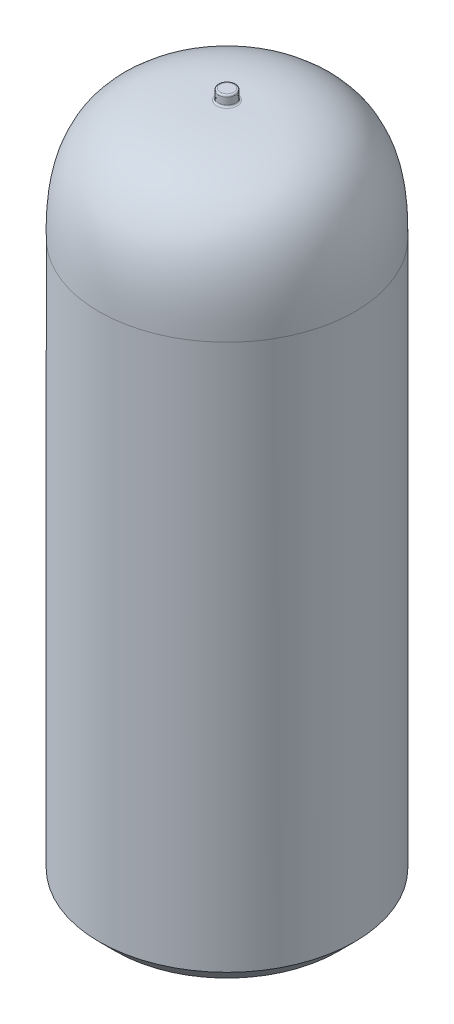
ISO-10303-21;
HEADER;
FILE_DESCRIPTION(('STEP AP214'),'2;1');
FILE_NAME('part.step','',(''),(''),'','','');
FILE_SCHEMA(('AUTOMOTIVE_DESIGN { 1 0 10303 214 1 1 1 1 }'));
ENDSEC;
DATA;
#1=APPLICATION_CONTEXT('core data for automotive mechanical design processes');
#2=APPLICATION_PROTOCOL_DEFINITION('international standard','automotive_design',2000,#1);
#3=PRODUCT_CONTEXT('',#1,'mechanical');
#4=PRODUCT('Part','Part','',(#3));
#5=PRODUCT_RELATED_PRODUCT_CATEGORY('part','',(#4));
#6=PRODUCT_DEFINITION_FORMATION('','',#4);
#7=PRODUCT_DEFINITION_CONTEXT('part definition',#1,'design');
#8=PRODUCT_DEFINITION('design','',#6,#7);
#9=PRODUCT_DEFINITION_SHAPE('','',#8);
#10=(LENGTH_UNIT() NAMED_UNIT(*) SI_UNIT(.MILLI.,.METRE.));
#11=(NAMED_UNIT(*) PLANE_ANGLE_UNIT() SI_UNIT($,.RADIAN.));
#12=(NAMED_UNIT(*) SI_UNIT($,.STERADIAN.) SOLID_ANGLE_UNIT());
#13=UNCERTAINTY_MEASURE_WITH_UNIT(LENGTH_MEASURE(1.E-05),#10,'distance_accuracy_value','');
#14=(GEOMETRIC_REPRESENTATION_CONTEXT(3) GLOBAL_UNCERTAINTY_ASSIGNED_CONTEXT((#13)) GLOBAL_UNIT_ASSIGNED_CONTEXT((#10,
#11,#12)) REPRESENTATION_CONTEXT('',''));
#15=CARTESIAN_POINT('',(0.,0.,0.));
#16=DIRECTION('',(0.,0.,1.));
#17=DIRECTION('',(1.,0.,0.));
#18=AXIS2_PLACEMENT_3D('',#15,#16,#17);
#19=CARTESIAN_POINT('',(0.,0.,0.));
#20=DIRECTION('',(0.,1.,0.));
#21=DIRECTION('',(0.,0.,1.));
#22=AXIS2_PLACEMENT_3D('',#19,#20,#21);
#23=PLANE('',#22);
#24=CARTESIAN_POINT('',(0.,0.,0.));
#25=DIRECTION('',(0.,1.,0.));
#26=DIRECTION('',(0.,0.,1.));
#27=AXIS2_PLACEMENT_3D('',#24,#25,#26);
#28=CIRCLE('',#27,6.5);
#29=CARTESIAN_POINT('',(0.,0.,6.5));
#30=VERTEX_POINT('',#29);
#31=EDGE_CURVE('E10',#30,#30,#28,.F.);
#32=ORIENTED_EDGE('',*,*,#31,.T.);
#33=EDGE_LOOP('',(#32));
#34=FACE_BOUND('',#33,.T.);
#35=ADVANCED_FACE('F33',(#34),#23,.F.);
#36=CARTESIAN_POINT('',(0.,40.,0.));
#37=DIRECTION('',(0.,1.,0.));
#38=DIRECTION('',(0.,0.,1.));
#39=AXIS2_PLACEMENT_3D('',#36,#37,#38);
#40=CYLINDRICAL_SURFACE('',#39,7.5);
#41=CARTESIAN_POINT('',(0.,1.,0.));
#42=DIRECTION('',(0.,1.,0.));
#43=DIRECTION('',(0.,0.,1.));
#44=AXIS2_PLACEMENT_3D('',#41,#42,#43);
#45=CIRCLE('',#44,7.5);
#46=CARTESIAN_POINT('',(0.,1.,7.5));
#47=VERTEX_POINT('',#46);
#48=EDGE_CURVE('E40',#47,#47,#45,.T.);
#49=ORIENTED_EDGE('',*,*,#48,.T.);
#50=EDGE_LOOP('',(#49));
#51=FACE_BOUND('',#50,.T.);
#52=CARTESIAN_POINT('',(0.,33.,7.5));
#53=CARTESIAN_POINT('',(0.981615593537487,33.,7.5));
#54=CARTESIAN_POINT('',(2.94484678061248,33.,7.10948903686533));
#55=CARTESIAN_POINT('',(5.4413673339792,33.,5.44136733397921));
#56=CARTESIAN_POINT('',(7.10948903686534,33.,2.94484678061246));
#57=CARTESIAN_POINT('',(7.69525548156733,33.,0.));
#58=CARTESIAN_POINT('',(7.10948903686534,33.,-2.94484678061245));
#59=CARTESIAN_POINT('',(5.44136733397921,33.,-5.44136733397921));
#60=CARTESIAN_POINT('',(2.94484678061246,33.,-7.10948903686534));
#61=CARTESIAN_POINT('',(0.,33.,-7.69525548156733));
#62=CARTESIAN_POINT('',(-2.94484678061246,33.,-7.10948903686534));
#63=CARTESIAN_POINT('',(-5.44136733397921,33.,-5.44136733397922));
#64=CARTESIAN_POINT('',(-7.10948903686534,33.,-2.94484678061246));
#65=CARTESIAN_POINT('',(-7.69525548156733,33.,0.));
#66=CARTESIAN_POINT('',(-7.10948903686533,33.,2.94484678061248));
#67=CARTESIAN_POINT('',(-5.44136733397922,33.,5.4413673339792));
#68=CARTESIAN_POINT('',(-2.94484678061244,33.,7.10948903686535));
#69=CARTESIAN_POINT('',(-0.981615593537485,33.,7.5));
#70=CARTESIAN_POINT('',(0.,33.,7.5));
#71=B_SPLINE_CURVE_WITH_KNOTS('',3,(#52,#53,#54,#55,#56,#57,#58,#59,#60,#61,#62,#63,#64,#65,#66,
#67,#68,#69,#70),.UNSPECIFIED.,.T.,.F.,(4,1,1,1,1,1,1,1,1,1,1,1,1,1,1,1,4),(-3.14159265358979,
-2.74889357189107,-2.35619449019234,-1.96349540849362,-1.5707963267949,-1.17809724509617,
-0.785398163397448,-0.392699081698724,0.,0.392699081698724,0.785398163397448,1.17809724509617,
1.5707963267949,1.96349540849362,2.35619449019235,2.74889357189107,3.14159265358979),.UNSPECIFIED.);
#72=CARTESIAN_POINT('',(0.,33.,7.5));
#73=VERTEX_POINT('',#72);
#74=EDGE_CURVE('E191',#73,#73,#71,.F.);
#75=ORIENTED_EDGE('',*,*,#74,.T.);
#76=EDGE_LOOP('',(#75));
#77=FACE_BOUND('',#76,.T.);
#78=ADVANCED_FACE('F139',(#51,#77),#40,.T.);
#79=CARTESIAN_POINT('',(0.,33.,7.5));
#80=CARTESIAN_POINT('',(-0.981615593537485,33.,7.5));
#81=CARTESIAN_POINT('',(-2.94484678061244,33.,7.10948903686535));
#82=CARTESIAN_POINT('',(-5.44136733397922,33.,5.4413673339792));
#83=CARTESIAN_POINT('',(-7.10948903686533,33.,2.94484678061248));
#84=CARTESIAN_POINT('',(-7.69525548156733,33.,0.));
#85=CARTESIAN_POINT('',(-7.10948903686534,33.,-2.94484678061246));
#86=CARTESIAN_POINT('',(-5.44136733397921,33.,-5.44136733397922));
#87=CARTESIAN_POINT('',(-2.94484678061246,33.,-7.10948903686534));
#88=CARTESIAN_POINT('',(0.,33.,-7.69525548156733));
#89=CARTESIAN_POINT('',(2.94484678061246,33.,-7.10948903686534));
#90=CARTESIAN_POINT('',(5.44136733397921,33.,-5.44136733397921));
#91=CARTESIAN_POINT('',(7.10948903686534,33.,-2.94484678061245));
#92=CARTESIAN_POINT('',(7.69525548156733,33.,0.));
#93=CARTESIAN_POINT('',(7.10948903686534,33.,2.94484678061246));
#94=CARTESIAN_POINT('',(5.4413673339792,33.,5.44136733397921));
#95=CARTESIAN_POINT('',(2.94484678061248,33.,7.10948903686533));
#96=CARTESIAN_POINT('',(0.981615593537487,33.,7.5));
#97=CARTESIAN_POINT('',(0.,33.,7.5));
#98=CARTESIAN_POINT('',(0.,34.1773863607376,7.5));
#99=CARTESIAN_POINT('',(-0.981615593537485,34.1773863607376,7.5));
#100=CARTESIAN_POINT('',(-2.94484678061244,34.1773863607376,7.10948903686535));
#101=CARTESIAN_POINT('',(-5.44136733397922,34.1773863607376,5.4413673339792));
#102=CARTESIAN_POINT('',(-7.10948903686533,34.1773863607376,2.94484678061248));
#103=CARTESIAN_POINT('',(-7.69525548156733,34.1773863607376,0.));
#104=CARTESIAN_POINT('',(-7.10948903686534,34.1773863607376,-2.94484678061246));
#105=CARTESIAN_POINT('',(-5.44136733397921,34.1773863607376,-5.44136733397922));
#106=CARTESIAN_POINT('',(-2.94484678061246,34.1773863607376,-7.10948903686534));
#107=CARTESIAN_POINT('',(0.,34.1773863607376,-7.69525548156733));
#108=CARTESIAN_POINT('',(2.94484678061246,34.1773863607376,-7.10948903686534));
#109=CARTESIAN_POINT('',(5.44136733397921,34.1773863607376,-5.44136733397921));
#110=CARTESIAN_POINT('',(7.10948903686534,34.1773863607376,-2.94484678061245));
#111=CARTESIAN_POINT('',(7.69525548156733,34.1773863607376,0.));
#112=CARTESIAN_POINT('',(7.10948903686534,34.1773863607376,2.94484678061246));
#113=CARTESIAN_POINT('',(5.4413673339792,34.1773863607376,5.44136733397921));
#114=CARTESIAN_POINT('',(2.94484678061248,34.1773863607376,7.10948903686533));
#115=CARTESIAN_POINT('',(0.981615593537487,34.1773863607376,7.5));
#116=CARTESIAN_POINT('',(0.,34.1773863607376,7.5));
#117=CARTESIAN_POINT('',(0.,35.3547727214752,7.5));
#118=CARTESIAN_POINT('',(-0.981615593537485,35.3547727214752,7.5));
#119=CARTESIAN_POINT('',(-2.94484678061244,35.3547727214753,7.10948903686535));
#120=CARTESIAN_POINT('',(-5.44136733397922,35.3547727214752,5.4413673339792));
#121=CARTESIAN_POINT('',(-7.10948903686533,35.3547727214753,2.94484678061248));
#122=CARTESIAN_POINT('',(-7.69525548156733,35.3547727214753,0.));
#123=CARTESIAN_POINT('',(-7.10948903686535,35.3547727214752,-2.94484678061246));
#124=CARTESIAN_POINT('',(-5.4413673339792,35.3547727214753,-5.44136733397921));
#125=CARTESIAN_POINT('',(-2.94484678061246,35.3547727214753,-7.10948903686534));
#126=CARTESIAN_POINT('',(0.,35.3547727214752,-7.69525548156733));
#127=CARTESIAN_POINT('',(2.94484678061246,35.3547727214753,-7.10948903686534));
#128=CARTESIAN_POINT('',(5.44136733397921,35.3547727214752,-5.44136733397921));
#129=CARTESIAN_POINT('',(7.10948903686534,35.3547727214752,-2.94484678061245));
#130=CARTESIAN_POINT('',(7.69525548156733,35.3547727214752,0.));
#131=CARTESIAN_POINT('',(7.10948903686534,35.3547727214753,2.94484678061246));
#132=CARTESIAN_POINT('',(5.4413673339792,35.3547727214752,5.44136733397921));
#133=CARTESIAN_POINT('',(2.94484678061248,35.3547727214753,7.10948903686533));
#134=CARTESIAN_POINT('',(0.981615593537487,35.3547727214752,7.5));
#135=CARTESIAN_POINT('',(0.,35.3547727214752,7.5));
#136=CARTESIAN_POINT('',(0.,37.9497474683058,6.99815656114742));
#137=CARTESIAN_POINT('',(-0.915933280858528,37.9497474683058,6.99815656114742));
#138=CARTESIAN_POINT('',(-2.74779984257557,37.9497474683058,6.63377564663265));
#139=CARTESIAN_POINT('',(-5.07727206798665,37.9497474683058,5.07727206798663));
#140=CARTESIAN_POINT('',(-6.63377564663263,37.9497474683058,2.74779984257561));
#141=CARTESIAN_POINT('',(-7.1803470184048,37.9497474683058,0.));
#142=CARTESIAN_POINT('',(-6.63377564663265,37.9497474683058,-2.74779984257559));
#143=CARTESIAN_POINT('',(-5.07727206798664,37.9497474683058,-5.07727206798665));
#144=CARTESIAN_POINT('',(-2.74779984257559,37.9497474683059,-6.63377564663264));
#145=CARTESIAN_POINT('',(0.,37.9497474683058,-7.18034701840481));
#146=CARTESIAN_POINT('',(2.74779984257559,37.9497474683058,-6.63377564663264));
#147=CARTESIAN_POINT('',(5.07727206798665,37.9497474683059,-5.07727206798665));
#148=CARTESIAN_POINT('',(6.63377564663264,37.9497474683058,-2.74779984257558));
#149=CARTESIAN_POINT('',(7.18034701840481,37.9497474683059,0.));
#150=CARTESIAN_POINT('',(6.63377564663264,37.9497474683058,2.74779984257559));
#151=CARTESIAN_POINT('',(5.07727206798664,37.9497474683058,5.07727206798665));
#152=CARTESIAN_POINT('',(2.74779984257561,37.9497474683058,6.63377564663263));
#153=CARTESIAN_POINT('',(0.91593328085853,37.9497474683058,6.99815656114741));
#154=CARTESIAN_POINT('',(0.,37.9497474683058,6.99815656114742));
#155=CARTESIAN_POINT('',(0.,39.4981565611474,5.44974746830583));
#156=CARTESIAN_POINT('',(-0.713274279430725,39.4981565611474,5.44974746830583));
#157=CARTESIAN_POINT('',(-2.13982283829216,39.4981565611474,5.16598931728068));
#158=CARTESIAN_POINT('',(-3.95387704699671,39.4981565611474,3.95387704699669));
#159=CARTESIAN_POINT('',(-5.16598931728066,39.4981565611474,2.1398228382922));
#160=CARTESIAN_POINT('',(-5.59162654381842,39.4981565611474,0.));
#161=CARTESIAN_POINT('',(-5.16598931728066,39.4981565611474,-2.13982283829217));
#162=CARTESIAN_POINT('',(-3.9538770469967,39.4981565611474,-3.95387704699671));
#163=CARTESIAN_POINT('',(-2.13982283829218,39.4981565611474,-5.16598931728067));
#164=CARTESIAN_POINT('',(0.,39.4981565611474,-5.59162654381841));
#165=CARTESIAN_POINT('',(2.13982283829218,39.4981565611474,-5.16598931728067));
#166=CARTESIAN_POINT('',(3.9538770469967,39.4981565611474,-3.9538770469967));
#167=CARTESIAN_POINT('',(5.16598931728066,39.4981565611474,-2.13982283829217));
#168=CARTESIAN_POINT('',(5.59162654381841,39.4981565611474,0.));
#169=CARTESIAN_POINT('',(5.16598931728067,39.4981565611474,2.13982283829218));
#170=CARTESIAN_POINT('',(3.95387704699669,39.4981565611474,3.9538770469967));
#171=CARTESIAN_POINT('',(2.13982283829219,39.4981565611474,5.16598931728066));
#172=CARTESIAN_POINT('',(0.713274279430727,39.4981565611474,5.44974746830583));
#173=CARTESIAN_POINT('',(0.,39.4981565611474,5.44974746830583));
#174=CARTESIAN_POINT('',(0.,40.,2.85477272147525));
#175=CARTESIAN_POINT('',(-0.373638589254074,40.,2.85477272147525));
#176=CARTESIAN_POINT('',(-1.12091576776221,40.,2.70613004880941));
#177=CARTESIAN_POINT('',(-2.07118227100938,40.,2.07118227100938));
#178=CARTESIAN_POINT('',(-2.7061300488094,40.,1.12091576776223));
#179=CARTESIAN_POINT('',(-2.92909405780817,40.,0.));
#180=CARTESIAN_POINT('',(-2.7061300488094,40.,-1.12091576776222));
#181=CARTESIAN_POINT('',(-2.07118227100938,40.,-2.07118227100938));
#182=CARTESIAN_POINT('',(-1.12091576776222,40.,-2.70613004880941));
#183=CARTESIAN_POINT('',(0.,40.,-2.92909405780817));
#184=CARTESIAN_POINT('',(1.12091576776222,40.,-2.70613004880941));
#185=CARTESIAN_POINT('',(2.07118227100938,40.,-2.07118227100938));
#186=CARTESIAN_POINT('',(2.7061300488094,40.,-1.12091576776222));
#187=CARTESIAN_POINT('',(2.92909405780817,40.,0.));
#188=CARTESIAN_POINT('',(2.70613004880941,40.,1.12091576776222));
#189=CARTESIAN_POINT('',(2.07118227100938,40.,2.07118227100938));
#190=CARTESIAN_POINT('',(1.12091576776223,40.,2.7061300488094));
#191=CARTESIAN_POINT('',(0.373638589254074,40.,2.85477272147525));
#192=CARTESIAN_POINT('',(0.,40.,2.85477272147525));
#193=CARTESIAN_POINT('',(0.,40.,1.67738636073762));
#194=CARTESIAN_POINT('',(-0.21953981441162,40.,1.67738636073763));
#195=CARTESIAN_POINT('',(-0.658619443234854,40.,1.59004799230022));
#196=CARTESIAN_POINT('',(-1.21697004663733,40.,1.21697004663733));
#197=CARTESIAN_POINT('',(-1.59004799230021,40.,0.658619443234865));
#198=CARTESIAN_POINT('',(-1.72105554495633,40.,0.));
#199=CARTESIAN_POINT('',(-1.59004799230021,40.,-0.658619443234858));
#200=CARTESIAN_POINT('',(-1.21697004663733,40.,-1.21697004663733));
#201=CARTESIAN_POINT('',(-0.658619443234859,40.,-1.59004799230021));
#202=CARTESIAN_POINT('',(0.,40.,-1.72105554495633));
#203=CARTESIAN_POINT('',(0.658619443234859,40.,-1.59004799230021));
#204=CARTESIAN_POINT('',(1.21697004663733,40.,-1.21697004663733));
#205=CARTESIAN_POINT('',(1.59004799230021,40.,-0.658619443234857));
#206=CARTESIAN_POINT('',(1.72105554495633,40.,0.));
#207=CARTESIAN_POINT('',(1.59004799230022,40.,0.65861944323486));
#208=CARTESIAN_POINT('',(1.21697004663733,40.,1.21697004663733));
#209=CARTESIAN_POINT('',(0.658619443234865,40.,1.59004799230021));
#210=CARTESIAN_POINT('',(0.21953981441162,40.,1.67738636073762));
#211=CARTESIAN_POINT('',(0.,40.,1.67738636073762));
#212=CARTESIAN_POINT('',(0.,40.,0.5));
#213=CARTESIAN_POINT('',(-0.0654410395691656,40.,0.5));
#214=CARTESIAN_POINT('',(-0.196323118707496,40.,0.473965935791023));
#215=CARTESIAN_POINT('',(-0.362757822265281,40.,0.362757822265279));
#216=CARTESIAN_POINT('',(-0.473965935791022,40.,0.196323118707499));
#217=CARTESIAN_POINT('',(-0.513017032104488,40.,0.));
#218=CARTESIAN_POINT('',(-0.473965935791022,40.,-0.196323118707497));
#219=CARTESIAN_POINT('',(-0.36275782226528,40.,-0.362757822265281));
#220=CARTESIAN_POINT('',(-0.196323118707497,40.,-0.473965935791022));
#221=CARTESIAN_POINT('',(0.,40.,-0.513017032104488));
#222=CARTESIAN_POINT('',(0.196323118707497,40.,-0.473965935791022));
#223=CARTESIAN_POINT('',(0.36275782226528,40.,-0.362757822265281));
#224=CARTESIAN_POINT('',(0.473965935791023,40.,-0.196323118707497));
#225=CARTESIAN_POINT('',(0.513017032104488,40.,0.));
#226=CARTESIAN_POINT('',(0.473965935791022,40.,0.196323118707497));
#227=CARTESIAN_POINT('',(0.36275782226528,40.,0.362757822265281));
#228=CARTESIAN_POINT('',(0.196323118707498,40.,0.473965935791022));
#229=CARTESIAN_POINT('',(0.0654410395691657,40.,0.499999999999999));
#230=CARTESIAN_POINT('',(0.,40.,0.5));
#231=B_SPLINE_SURFACE_WITH_KNOTS('',5,3,((#79,#80,#81,#82,#83,#84,#85,#86,#87,#88,#89,#90,#91,
#92,#93,#94,#95,#96,#97),(#98,#99,#100,#101,#102,#103,#104,#105,#106,#107,#108,#109,#110,#111,
#112,#113,#114,#115,#116),(#117,#118,#119,#120,#121,#122,#123,#124,#125,#126,#127,#128,#129,
#130,#131,#132,#133,#134,#135),(#136,#137,#138,#139,#140,#141,#142,#143,#144,#145,#146,#147,
#148,#149,#150,#151,#152,#153,#154),(#155,#156,#157,#158,#159,#160,#161,#162,#163,#164,#165,
#166,#167,#168,#169,#170,#171,#172,#173),(#174,#175,#176,#177,#178,#179,#180,#181,#182,#183,
#184,#185,#186,#187,#188,#189,#190,#191,#192),(#193,#194,#195,#196,#197,#198,#199,#200,#201,
#202,#203,#204,#205,#206,#207,#208,#209,#210,#211),(#212,#213,#214,#215,#216,#217,#218,#219,
#220,#221,#222,#223,#224,#225,#226,#227,#228,#229,#230)),.UNSPECIFIED.,.F.,.T.,.F.,(6,2,6),(4,1,
1,1,1,1,1,1,1,1,1,1,1,1,1,1,4),(0.,0.5,1.),(-3.14159265358979,-2.74889357189107,
-2.35619449019235,-1.96349540849362,-1.5707963267949,-1.17809724509617,-0.785398163397448,
-0.392699081698724,0.,0.392699081698724,0.785398163397448,1.17809724509617,1.5707963267949,
1.96349540849362,2.35619449019234,2.74889357189107,3.14159265358979),.UNSPECIFIED.);
#232=CARTESIAN_POINT('',(0.,39.9999878160045,0.599963537963958));
#233=CARTESIAN_POINT('',(-0.078524475255912,39.9999878160045,0.599963537963958));
#234=CARTESIAN_POINT('',(-0.235573425767734,39.9999878160045,0.568724559423161));
#235=CARTESIAN_POINT('',(-0.435282932940758,39.9999878160045,0.435282932940755));
#236=CARTESIAN_POINT('',(-0.568724559423159,39.9999878160045,0.235573425767738));
#237=CARTESIAN_POINT('',(-0.615583027234357,39.9999878160045,0.));
#238=CARTESIAN_POINT('',(-0.56872455942316,39.9999878160045,-0.235573425767736));
#239=CARTESIAN_POINT('',(-0.435282932940756,39.9999878160045,-0.435282932940757));
#240=CARTESIAN_POINT('',(-0.235573425767736,39.9999878160045,-0.56872455942316));
#241=CARTESIAN_POINT('',(0.,39.9999878160045,-0.615583027234357));
#242=CARTESIAN_POINT('',(0.235573425767736,39.9999878160045,-0.56872455942316));
#243=CARTESIAN_POINT('',(0.435282932940757,39.9999878160045,-0.435282932940757));
#244=CARTESIAN_POINT('',(0.56872455942316,39.9999878160045,-0.235573425767736));
#245=CARTESIAN_POINT('',(0.615583027234357,39.9999878160045,0.));
#246=CARTESIAN_POINT('',(0.56872455942316,39.9999878160045,0.235573425767736));
#247=CARTESIAN_POINT('',(0.435282932940756,39.9999878160045,0.435282932940757));
#248=CARTESIAN_POINT('',(0.235573425767738,39.9999878160045,0.56872455942316));
#249=CARTESIAN_POINT('',(0.0785244752559122,39.9999878160045,0.599963537963957));
#250=CARTESIAN_POINT('',(0.,39.9999878160045,0.599963537963958));
#251=B_SPLINE_CURVE_WITH_KNOTS('',3,(#232,#233,#234,#235,#236,#237,#238,#239,#240,#241,#242,
#243,#244,#245,#246,#247,#248,#249,#250),.UNSPECIFIED.,.T.,.F.,(4,1,1,1,1,1,1,1,1,1,1,1,1,1,1,1,
4),(-3.14159265358979,-2.74889357189107,-2.35619449019235,-1.96349540849362,-1.5707963267949,
-1.17809724509617,-0.785398163397448,-0.392699081698724,0.,0.392699081698724,0.785398163397448,
1.17809724509617,1.5707963267949,1.96349540849362,2.35619449019234,2.74889357189107,
3.14159265358979),.UNSPECIFIED.);
#252=CARTESIAN_POINT('',(0.,39.9999878160045,0.599963537963958));
#253=VERTEX_POINT('',#252);
#254=EDGE_CURVE('E44',#253,#253,#251,.T.);
#255=ORIENTED_EDGE('',*,*,#254,.T.);
#256=EDGE_LOOP('',(#255));
#257=FACE_BOUND('',#256,.T.);
#258=ORIENTED_EDGE('',*,*,#74,.F.);
#259=EDGE_LOOP('',(#258));
#260=FACE_BOUND('',#259,.T.);
#261=ADVANCED_FACE('F125',(#257,#260),#231,.T.);
#262=CARTESIAN_POINT('',(0.,40.6,0.499999999999999));
#263=CARTESIAN_POINT('',(0.130601937481871,40.6,0.499999999999999));
#264=CARTESIAN_POINT('',(0.391805812445612,40.6,0.391805812445612));
#265=CARTESIAN_POINT('',(0.554097093777193,40.6,0.));
#266=CARTESIAN_POINT('',(0.391805812445612,40.6,-0.391805812445612));
#267=CARTESIAN_POINT('',(0.,40.6,-0.554097093777193));
#268=CARTESIAN_POINT('',(-0.39180581244561,40.6,-0.391805812445612));
#269=CARTESIAN_POINT('',(-0.554097093777195,40.6,0.));
#270=CARTESIAN_POINT('',(-0.391805812445612,40.6,0.391805812445612));
#271=CARTESIAN_POINT('',(-0.130601937481871,40.6,0.499999999999999));
#272=CARTESIAN_POINT('',(0.,40.6,0.499999999999999));
#273=B_SPLINE_CURVE_WITH_KNOTS('',3,(#262,#263,#264,#265,#266,#267,#268,#269,#270,#271,#272),
.UNSPECIFIED.,.T.,.F.,(4,1,1,1,1,1,1,1,4),(0.,0.125,0.25,0.375,0.5,0.625,0.75,0.875,1.),.UNSPECIFIED.);
#274=DIRECTION('',(0.,-1.,0.));
#275=VECTOR('',#274,1.);
#276=SURFACE_OF_LINEAR_EXTRUSION('',#273,#275);
#277=CARTESIAN_POINT('',(0.,40.5,0.499999999999999));
#278=CARTESIAN_POINT('',(-0.130601937481871,40.5,0.499999999999999));
#279=CARTESIAN_POINT('',(-0.391805812445612,40.5,0.391805812445612));
#280=CARTESIAN_POINT('',(-0.554097093777195,40.5,0.));
#281=CARTESIAN_POINT('',(-0.39180581244561,40.5,-0.391805812445612));
#282=CARTESIAN_POINT('',(0.,40.5,-0.554097093777193));
#283=CARTESIAN_POINT('',(0.391805812445612,40.5,-0.391805812445612));
#284=CARTESIAN_POINT('',(0.554097093777193,40.5,0.));
#285=CARTESIAN_POINT('',(0.391805812445612,40.5,0.391805812445612));
#286=CARTESIAN_POINT('',(0.130601937481871,40.5,0.499999999999999));
#287=CARTESIAN_POINT('',(0.,40.5,0.499999999999999));
#288=B_SPLINE_CURVE_WITH_KNOTS('',3,(#277,#278,#279,#280,#281,#282,#283,#284,#285,#286,#287),
.UNSPECIFIED.,.T.,.F.,(4,1,1,1,1,1,1,1,4),(0.,0.125,0.25,0.375,0.5,0.625,0.75,0.875,1.),.UNSPECIFIED.);
#289=CARTESIAN_POINT('',(0.,40.5,0.499999999999999));
#290=VERTEX_POINT('',#289);
#291=EDGE_CURVE('E48',#290,#290,#288,.T.);
#292=ORIENTED_EDGE('',*,*,#291,.T.);
#293=EDGE_LOOP('',(#292));
#294=FACE_BOUND('',#293,.T.);
#295=CARTESIAN_POINT('',(0.,40.0999878093571,0.499999999999999));
#296=CARTESIAN_POINT('',(0.130601937481871,40.0999878093571,0.499999999999999));
#297=CARTESIAN_POINT('',(0.391805812445612,40.0999878093571,0.391805812445612));
#298=CARTESIAN_POINT('',(0.554097093777193,40.0999878093571,0.));
#299=CARTESIAN_POINT('',(0.391805812445612,40.0999878093571,-0.391805812445612));
#300=CARTESIAN_POINT('',(0.,40.0999878093571,-0.554097093777193));
#301=CARTESIAN_POINT('',(-0.39180581244561,40.0999878093571,-0.391805812445612));
#302=CARTESIAN_POINT('',(-0.554097093777195,40.0999878093571,0.));
#303=CARTESIAN_POINT('',(-0.391805812445612,40.0999878093571,0.391805812445612));
#304=CARTESIAN_POINT('',(-0.130601937481871,40.0999878093571,0.499999999999999));
#305=CARTESIAN_POINT('',(0.,40.0999878093571,0.499999999999999));
#306=B_SPLINE_CURVE_WITH_KNOTS('',3,(#295,#296,#297,#298,#299,#300,#301,#302,#303,#304,#305),
.UNSPECIFIED.,.T.,.F.,(4,1,1,1,1,1,1,1,4),(0.,0.125,0.25,0.375,0.5,0.625,0.75,0.875,1.),.UNSPECIFIED.);
#307=CARTESIAN_POINT('',(0.,40.0999878093571,0.499999999999999));
#308=VERTEX_POINT('',#307);
#309=EDGE_CURVE('E94',#308,#308,#306,.T.);
#310=ORIENTED_EDGE('',*,*,#309,.T.);
#311=EDGE_LOOP('',(#310));
#312=FACE_BOUND('',#311,.T.);
#313=ADVANCED_FACE('F138',(#294,#312),#276,.F.);
#314=CARTESIAN_POINT('',(0.,40.6,-0.499999999999999));
#315=DIRECTION('',(0.,-1.,0.));
#316=DIRECTION('',(0.,0.,-1.));
#317=AXIS2_PLACEMENT_3D('',#314,#315,#316);
#318=PLANE('',#317);
#319=CARTESIAN_POINT('',(0.,40.6,0.399999999999999));
#320=CARTESIAN_POINT('',(-0.104465671257339,40.6,0.399943221596001));
#321=CARTESIAN_POINT('',(-0.313705103229686,40.6,0.313299053611087));
#322=CARTESIAN_POINT('',(-0.443115535290622,40.6,-0.000131206714801948));
#323=CARTESIAN_POINT('',(-0.313832754279589,40.6,-0.31285132708133));
#324=CARTESIAN_POINT('',(-0.000760596124557661,40.6,-0.443365958978101));
#325=CARTESIAN_POINT('',(0.313457287550801,40.6,-0.313682227406401));
#326=CARTESIAN_POINT('',(0.443363301319796,40.6,0.000414420608407867));
#327=CARTESIAN_POINT('',(0.313088924314346,40.6,0.313639724035075));
#328=CARTESIAN_POINT('',(0.104465671257339,40.6,0.400056778403997));
#329=CARTESIAN_POINT('',(0.,40.6,0.399999999999999));
#330=B_SPLINE_CURVE_WITH_KNOTS('',3,(#319,#320,#321,#322,#323,#324,#325,#326,#327,#328,#329),
.UNSPECIFIED.,.T.,.F.,(4,1,1,1,1,1,1,1,4),(3.81429000116452E-05,0.000350172339615307,
0.000662201779218969,0.000974231218822632,0.00128626065842629,0.00159829009802996,
0.00191031953763362,0.00222234897723728,0.00253437841684094),.UNSPECIFIED.);
#331=CARTESIAN_POINT('',(0.,40.6,0.399999999999999));
#332=VERTEX_POINT('',#331);
#333=EDGE_CURVE('E119',#332,#332,#330,.F.);
#334=ORIENTED_EDGE('',*,*,#333,.T.);
#335=EDGE_LOOP('',(#334));
#336=FACE_BOUND('',#335,.T.);
#337=ADVANCED_FACE('F167',(#336),#318,.F.);
#338=CARTESIAN_POINT('',(0.,40.6,0.399999999999999));
#339=CARTESIAN_POINT('',(0.104465671257339,40.6,0.400056778403997));
#340=CARTESIAN_POINT('',(0.313088924314346,40.6,0.313639724035075));
#341=CARTESIAN_POINT('',(0.443363301319796,40.6,0.000414420608407867));
#342=CARTESIAN_POINT('',(0.313457287550801,40.6,-0.313682227406401));
#343=CARTESIAN_POINT('',(-0.000760596124557661,40.6,-0.443365958978101));
#344=CARTESIAN_POINT('',(-0.313832754279589,40.6,-0.31285132708133));
#345=CARTESIAN_POINT('',(-0.443115535290622,40.6,-0.000131206714801948));
#346=CARTESIAN_POINT('',(-0.313705103229686,40.6,0.313299053611087));
#347=CARTESIAN_POINT('',(-0.104465671257339,40.6,0.399943221596001));
#348=CARTESIAN_POINT('',(0.,40.6,0.399999999999999));
#349=CARTESIAN_POINT('',(0.,40.6,0.416819805153395));
#350=CARTESIAN_POINT('',(0.10885835359022,40.6,0.416879143904046));
#351=CARTESIAN_POINT('',(0.326253078702255,40.6,0.326828714930322));
#352=CARTESIAN_POINT('',(0.462006773322449,40.6,0.000433107890616077));
#353=CARTESIAN_POINT('',(0.326638049792011,40.6,-0.326873135959982));
#354=CARTESIAN_POINT('',(-0.000794885714234545,40.6,-0.462009548947905));
#355=CARTESIAN_POINT('',(-0.327030447714074,40.6,-0.326004771931773));
#356=CARTESIAN_POINT('',(-0.461747834744771,40.6,-0.000137121989739691));
#357=CARTESIAN_POINT('',(-0.326897042839065,40.6,0.326472682426411));
#358=CARTESIAN_POINT('',(-0.10885835359022,40.6,0.416760466402743));
#359=CARTESIAN_POINT('',(0.,40.6,0.416819805153395));
#360=CARTESIAN_POINT('',(0.,40.6,0.43363961030679));
#361=CARTESIAN_POINT('',(0.113251035923101,40.6,0.433701509404096));
#362=CARTESIAN_POINT('',(0.339417233090163,40.6,0.340017705825569));
#363=CARTESIAN_POINT('',(0.480650245325101,40.6,0.000451795172824297));
#364=CARTESIAN_POINT('',(0.339818812033221,40.6,-0.340064044513562));
#365=CARTESIAN_POINT('',(-0.000829175303911472,40.6,-0.480653138917709));
#366=CARTESIAN_POINT('',(-0.340228141148559,40.6,-0.339158216782215));
#367=CARTESIAN_POINT('',(-0.48038013419892,40.6,-0.000143037264677456));
#368=CARTESIAN_POINT('',(-0.340088982448445,40.6,0.339646311241735));
#369=CARTESIAN_POINT('',(-0.113251035923101,40.6,0.433577711209484));
#370=CARTESIAN_POINT('',(0.,40.6,0.43363961030679));
#371=CARTESIAN_POINT('',(0.,40.5928308080164,0.470710678118654));
#372=CARTESIAN_POINT('',(0.122932564523053,40.5928308080164,0.470778220253056));
#373=CARTESIAN_POINT('',(0.368431199396514,40.5928308080164,0.369086412114897));
#374=CARTESIAN_POINT('',(0.521740698428204,40.5928308080164,0.000492982184186317));
#375=CARTESIAN_POINT('',(0.368869382262765,40.5928308080164,-0.369136977346626));
#376=CARTESIAN_POINT('',(-0.000904750002462836,40.5928308080164,-0.521743852021938));
#377=CARTESIAN_POINT('',(-0.369316027946771,40.5928308080164,-0.368148579129662));
#378=CARTESIAN_POINT('',(-0.521445962860818,40.5928308080164,-0.000156074607045344));
#379=CARTESIAN_POINT('',(-0.369164187741806,40.5928308080164,0.368681159308488));
#380=CARTESIAN_POINT('',(-0.122932564523053,40.5928308080164,0.470643135984253));
#381=CARTESIAN_POINT('',(0.,40.5928308080164,0.470710678118654));
#382=CARTESIAN_POINT('',(0.,40.5707106781186,0.49283080801639));
#383=CARTESIAN_POINT('',(0.128709486604889,40.5707106781186,0.492901717324195));
#384=CARTESIAN_POINT('',(0.385743695135836,40.5707106781187,0.386431570941783));
#385=CARTESIAN_POINT('',(0.546259176417839,40.5707106781186,0.000517558278029892));
#386=CARTESIAN_POINT('',(0.386203719389012,40.5707106781187,-0.386484658132063));
#387=CARTESIAN_POINT('',(-0.000949845065745456,40.5707106781186,-0.546262485153008));
#388=CARTESIAN_POINT('',(-0.38667263169211,40.5707106781187,-0.385446990498937));
#389=CARTESIAN_POINT('',(-0.545949747563466,40.5707106781186,-0.00016385392724623));
#390=CARTESIAN_POINT('',(-0.386513224493498,40.5707106781186,0.386006115094953));
#391=CARTESIAN_POINT('',(-0.128709486604889,40.5707106781186,0.492759898708585));
#392=CARTESIAN_POINT('',(0.,40.5707106781186,0.49283080801639));
#393=CARTESIAN_POINT('',(0.,40.5336396103068,0.499999999999999));
#394=CARTESIAN_POINT('',(0.130581802168608,40.5336396103068,0.500072000617515));
#395=CARTESIAN_POINT('',(0.39135472030813,40.5336396103068,0.392053182306229));
#396=CARTESIAN_POINT('',(0.554205679294007,40.5336396103068,0.000525523454355101));
#397=CARTESIAN_POINT('',(0.391821823411963,40.5336396103068,-0.392107086869875));
#398=CARTESIAN_POINT('',(-0.000964460493760119,40.5336396103068,-0.554209038310922));
#399=CARTESIAN_POINT('',(-0.392297952384574,40.5336396103068,-0.391053450890043));
#400=CARTESIAN_POINT('',(-0.553891488306879,40.5336396103068,-0.000166375225280211));
#401=CARTESIAN_POINT('',(-0.39213609270352,40.5336396103068,0.391621178601131));
#402=CARTESIAN_POINT('',(-0.130581802168608,40.5336396103068,0.499927999382483));
#403=CARTESIAN_POINT('',(0.,40.5336396103068,0.499999999999999));
#404=CARTESIAN_POINT('',(0.,40.5168198051534,0.499999999999999));
#405=CARTESIAN_POINT('',(0.130581802168608,40.5168198051534,0.500072000617516));
#406=CARTESIAN_POINT('',(0.39135472030813,40.5168198051534,0.392053182306229));
#407=CARTESIAN_POINT('',(0.554205679294008,40.5168198051534,0.000525523454355108));
#408=CARTESIAN_POINT('',(0.391821823411963,40.5168198051534,-0.392107086869876));
#409=CARTESIAN_POINT('',(-0.00096446049376025,40.5168198051534,-0.554209038310922));
#410=CARTESIAN_POINT('',(-0.392297952384574,40.5168198051534,-0.391053450890044));
#411=CARTESIAN_POINT('',(-0.553891488306881,40.5168198051534,-0.000166375225280189));
#412=CARTESIAN_POINT('',(-0.392136092703519,40.5168198051534,0.391621178601131));
#413=CARTESIAN_POINT('',(-0.130581802168608,40.5168198051534,0.499927999382483));
#414=CARTESIAN_POINT('',(0.,40.5168198051534,0.499999999999999));
#415=CARTESIAN_POINT('',(0.,40.5,0.499999999999999));
#416=CARTESIAN_POINT('',(0.130581802168608,40.5,0.500072000617516));
#417=CARTESIAN_POINT('',(0.39135472030813,40.5,0.392053182306229));
#418=CARTESIAN_POINT('',(0.554205679294008,40.5,0.000525523454355108));
#419=CARTESIAN_POINT('',(0.391821823411963,40.5,-0.392107086869876));
#420=CARTESIAN_POINT('',(-0.000964460493760381,40.5,-0.554209038310922));
#421=CARTESIAN_POINT('',(-0.392297952384574,40.5,-0.391053450890044));
#422=CARTESIAN_POINT('',(-0.553891488306883,40.5,-0.000166375225280189));
#423=CARTESIAN_POINT('',(-0.392136092703519,40.5,0.391621178601131));
#424=CARTESIAN_POINT('',(-0.130581802168608,40.5,0.499927999382483));
#425=CARTESIAN_POINT('',(0.,40.5,0.499999999999999));
#426=B_SPLINE_SURFACE_WITH_KNOTS('',5,3,((#338,#339,#340,#341,#342,#343,#344,#345,#346,#347,
#348),(#349,#350,#351,#352,#353,#354,#355,#356,#357,#358,#359),(#360,#361,#362,#363,#364,#365,
#366,#367,#368,#369,#370),(#371,#372,#373,#374,#375,#376,#377,#378,#379,#380,#381),(#382,#383,
#384,#385,#386,#387,#388,#389,#390,#391,#392),(#393,#394,#395,#396,#397,#398,#399,#400,#401,
#402,#403),(#404,#405,#406,#407,#408,#409,#410,#411,#412,#413,#414),(#415,#416,#417,#418,#419,
#420,#421,#422,#423,#424,#425)),.UNSPECIFIED.,.F.,.T.,.F.,(6,2,6),(4,1,1,1,1,1,1,1,4),(0.,0.5,
1.),(3.81429000116452E-05,0.000350172339615307,0.000662201779218969,0.000974231218822631,
0.00128626065842629,0.00159829009802996,0.00191031953763362,0.00222234897723728,
0.00253437841684094),.UNSPECIFIED.);
#427=ORIENTED_EDGE('',*,*,#291,.F.);
#428=EDGE_LOOP('',(#427));
#429=FACE_BOUND('',#428,.T.);
#430=ORIENTED_EDGE('',*,*,#333,.F.);
#431=EDGE_LOOP('',(#430));
#432=FACE_BOUND('',#431,.T.);
#433=ADVANCED_FACE('F70',(#429,#432),#426,.T.);
#434=CARTESIAN_POINT('',(0.,40.0999878093571,0.500000000000013));
#435=CARTESIAN_POINT('',(0.130593405106603,40.0999878093571,0.500061132889453));
#436=CARTESIAN_POINT('',(0.391454557213677,40.0999878093584,0.391979702353428));
#437=CARTESIAN_POINT('',(0.554167538263674,40.0999878093595,0.000470749572172766));
#438=CARTESIAN_POINT('',(0.391874702217675,40.0999878093547,-0.392036601134841));
#439=CARTESIAN_POINT('',(-0.00088549934702992,40.099987809366,-0.554184039356567));
#440=CARTESIAN_POINT('',(-0.392156954564239,40.0999878093609,-0.391224664963947));
#441=CARTESIAN_POINT('',(-0.553934292916238,40.0999878093558,-0.000108120042762494));
#442=CARTESIAN_POINT('',(-0.39210587342594,40.0999878093586,0.391612905016787));
#443=CARTESIAN_POINT('',(-0.130593405106603,40.0999878093571,0.499938867110573));
#444=CARTESIAN_POINT('',(0.,40.0999878093571,0.500000000000013));
#445=CARTESIAN_POINT('',(0.,40.0831731411511,0.500000000000013));
#446=CARTESIAN_POINT('',(0.130593405103003,40.083173141151,0.500061132915179));
#447=CARTESIAN_POINT('',(0.391454557065831,40.083173141152,0.391979702426572));
#448=CARTESIAN_POINT('',(0.55416753829331,40.0831731411528,0.000470749770231679));
#449=CARTESIAN_POINT('',(0.391874702246482,40.0831731411493,-0.392036601232047));
#450=CARTESIAN_POINT('',(-0.000885499719022965,40.0831731411575,-0.554184039392809));
#451=CARTESIAN_POINT('',(-0.392156954711788,40.0831731411539,-0.391224664719609));
#452=CARTESIAN_POINT('',(-0.553934292847791,40.0831731411501,-0.000108120088234983));
#453=CARTESIAN_POINT('',(-0.392105873552175,40.0831731411521,0.391612904935578));
#454=CARTESIAN_POINT('',(-0.130593405103,40.0831731411511,0.499938867084848));
#455=CARTESIAN_POINT('',(0.,40.0831731411511,0.500000000000013));
#456=CARTESIAN_POINT('',(0.,40.066358472945,0.500000000000013));
#457=CARTESIAN_POINT('',(0.130593405099402,40.066358472945,0.500061132940904));
#458=CARTESIAN_POINT('',(0.391454556917985,40.0663584729457,0.391979702499715));
#459=CARTESIAN_POINT('',(0.554167538322946,40.0663584729461,0.000470749968290455));
#460=CARTESIAN_POINT('',(0.391874702275288,40.0663584729439,-0.392036601329252));
#461=CARTESIAN_POINT('',(-0.000885500091015857,40.0663584729491,-0.554184039429051));
#462=CARTESIAN_POINT('',(-0.392156954859336,40.0663584729468,-0.39122466447527));
#463=CARTESIAN_POINT('',(-0.553934292779346,40.0663584729445,-0.000108120133707689));
#464=CARTESIAN_POINT('',(-0.39210587367841,40.0663584729457,0.39161290485437));
#465=CARTESIAN_POINT('',(-0.130593405099396,40.066358472945,0.499938867059123));
#466=CARTESIAN_POINT('',(0.,40.066358472945,0.500000000000013));
#467=CARTESIAN_POINT('',(0.,40.0293007650358,0.507164176580215));
#468=CARTESIAN_POINT('',(0.132464586547805,40.0293007650358,0.50722623553628));
#469=CARTESIAN_POINT('',(0.397063168391261,40.0293007650356,0.397596268489357));
#470=CARTESIAN_POINT('',(0.562107904386888,40.0293007650354,0.00047788046050962));
#471=CARTESIAN_POINT('',(0.397489677130171,40.0293007650362,-0.397654029340713));
#472=CARTESIAN_POINT('',(-0.000898910814592664,40.0293007650343,-0.562124655017048));
#473=CARTESIAN_POINT('',(-0.397776205558405,40.0293007650351,-0.396829794581545));
#474=CARTESIAN_POINT('',(-0.561871125669286,40.029300765036,-0.000109757626852861));
#475=CARTESIAN_POINT('',(-0.397724350895528,40.0293007650355,0.397223914752971));
#476=CARTESIAN_POINT('',(-0.132464586547791,40.0293007650358,0.507102117624151));
#477=CARTESIAN_POINT('',(0.,40.0293007650358,0.507164176580215));
#478=CARTESIAN_POINT('',(0.,40.0071767967939,0.529274606950527));
#479=CARTESIAN_POINT('',(0.138239517805155,40.007176796794,0.529339523678513));
#480=CARTESIAN_POINT('',(0.4143727388458,40.0071767967939,0.414930387346781));
#481=CARTESIAN_POINT('',(0.586613848348148,40.0071767967937,0.000499885846260471));
#482=CARTESIAN_POINT('',(0.414818885593862,40.0071767967942,-0.414990808480806));
#483=CARTESIAN_POINT('',(-0.000940297601847472,40.0071767967931,-0.586631369033499));
#484=CARTESIAN_POINT('',(-0.415118609687687,40.0071767967936,-0.414128621200901));
#485=CARTESIAN_POINT('',(-0.586366165916029,40.0071767967941,-0.000114811088487414));
#486=CARTESIAN_POINT('',(-0.415064367985062,40.0071767967938,0.414540886978867));
#487=CARTESIAN_POINT('',(-0.138239517805132,40.0071767967939,0.529209690222542));
#488=CARTESIAN_POINT('',(0.,40.0071767967939,0.529274606950527));
#489=CARTESIAN_POINT('',(0.,39.9999975132036,0.56634224008643));
#490=CARTESIAN_POINT('',(0.147921058588693,39.9999975132036,0.56641194775817));
#491=CARTESIAN_POINT('',(0.443391839895043,39.9999975132041,0.443990642841136));
#492=CARTESIAN_POINT('',(0.627697505428064,39.9999975132046,0.000536777022504365));
#493=CARTESIAN_POINT('',(0.443870909004554,39.9999975132026,-0.444055523837053));
#494=CARTESIAN_POINT('',(-0.00100968094716918,39.9999975132072,-0.627716317079164));
#495=CARTESIAN_POINT('',(-0.44419275511827,39.9999975132052,-0.443129710626341));
#496=CARTESIAN_POINT('',(-0.627431543342474,39.9999975132031,-0.00012328302105983));
#497=CARTESIAN_POINT('',(-0.444134511637024,39.9999975132041,0.443572396810699));
#498=CARTESIAN_POINT('',(-0.147921058588662,39.9999975132036,0.566272532414691));
#499=CARTESIAN_POINT('',(0.,39.9999975132036,0.56634224008643));
#500=CARTESIAN_POINT('',(0.,39.9999939449788,0.583154345363394));
#501=CARTESIAN_POINT('',(0.152312142376708,39.9999939449788,0.583226225973088));
#502=CARTESIAN_POINT('',(0.456553516044072,39.9999939449797,0.45717098463523));
#503=CARTESIAN_POINT('',(0.646331087055864,39.9999939449804,0.000553509056945397));
#504=CARTESIAN_POINT('',(0.457047517127585,39.9999939449771,-0.457237888406039));
#505=CARTESIAN_POINT('',(-0.00104114984156933,39.9999939449848,-0.646350484226857));
#506=CARTESIAN_POINT('',(-0.457379396708999,39.9999939449814,-0.456283217583189));
#507=CARTESIAN_POINT('',(-0.646056834212406,39.9999939449779,-0.0001271254755969));
#508=CARTESIAN_POINT('',(-0.457319338216075,39.9999939449797,0.456739700977063));
#509=CARTESIAN_POINT('',(-0.152312142376674,39.9999939449788,0.583082464753699));
#510=CARTESIAN_POINT('',(0.,39.9999939449788,0.583154345363394));
#511=CARTESIAN_POINT('',(0.,39.9999878160045,0.599963537963958));
#512=CARTESIAN_POINT('',(0.15670246541492,39.9999878160045,0.600037591135162));
#513=CARTESIAN_POINT('',(0.469712911949048,39.9999878160058,0.470349042951569));
#514=CARTESIAN_POINT('',(0.664961440438892,39.9999878160069,0.000570238192544373));
#515=CARTESIAN_POINT('',(0.470221842419555,39.9999878160021,-0.470417969146556));
#516=CARTESIAN_POINT('',(-0.00107261328398815,39.9999878160134,-0.664981423028842));
#517=CARTESIAN_POINT('',(-0.470563753730767,39.9999878160083,-0.469434445711346));
#518=CARTESIAN_POINT('',(-0.664678898273671,39.9999878160032,-0.000130967264423361));
#519=CARTESIAN_POINT('',(-0.470501880540357,39.9999878160059,0.469904723924342));
#520=CARTESIAN_POINT('',(-0.156702465414882,39.9999878160045,0.599889484792753));
#521=CARTESIAN_POINT('',(0.,39.9999878160045,0.599963537963958));
#522=B_SPLINE_SURFACE_WITH_KNOTS('',5,3,((#434,#435,#436,#437,#438,#439,#440,#441,#442,#443,
#444),(#445,#446,#447,#448,#449,#450,#451,#452,#453,#454,#455),(#456,#457,#458,#459,#460,#461,
#462,#463,#464,#465,#466),(#467,#468,#469,#470,#471,#472,#473,#474,#475,#476,#477),(#478,#479,
#480,#481,#482,#483,#484,#485,#486,#487,#488),(#489,#490,#491,#492,#493,#494,#495,#496,#497,
#498,#499),(#500,#501,#502,#503,#504,#505,#506,#507,#508,#509,#510),(#511,#512,#513,#514,#515,
#516,#517,#518,#519,#520,#521)),.UNSPECIFIED.,.F.,.T.,.F.,(6,2,6),(4,1,1,1,1,1,1,1,4),(0.,0.5,
1.),(5.28853666701586E-05,0.000521289884633384,0.00098969440259661,0.00145809892055984,
0.00192650343852306,0.00239490795648629,0.00286331247444951,0.00333171699241274,
0.00380012151037597),.UNSPECIFIED.);
#523=CARTESIAN_POINT('',(0.,40.0999878093571,0.500000000000013));
#524=CARTESIAN_POINT('',(0.130593405106603,40.0999878093571,0.500061132889453));
#525=CARTESIAN_POINT('',(0.391454557213677,40.0999878093584,0.391979702353428));
#526=CARTESIAN_POINT('',(0.554167538263674,40.0999878093595,0.000470749572172766));
#527=CARTESIAN_POINT('',(0.391874702217675,40.0999878093547,-0.392036601134841));
#528=CARTESIAN_POINT('',(-0.00088549934702992,40.099987809366,-0.554184039356567));
#529=CARTESIAN_POINT('',(-0.392156954564239,40.0999878093609,-0.391224664963947));
#530=CARTESIAN_POINT('',(-0.553934292916238,40.0999878093558,-0.000108120042762494));
#531=CARTESIAN_POINT('',(-0.39210587342594,40.0999878093586,0.391612905016787));
#532=CARTESIAN_POINT('',(-0.130593405106603,40.0999878093571,0.499938867110573));
#533=CARTESIAN_POINT('',(0.,40.0999878093571,0.500000000000013));
#534=CARTESIAN_POINT('',(0.,40.0831731411511,0.500000000000013));
#535=CARTESIAN_POINT('',(0.130593405103003,40.083173141151,0.500061132915179));
#536=CARTESIAN_POINT('',(0.391454557065831,40.083173141152,0.391979702426572));
#537=CARTESIAN_POINT('',(0.55416753829331,40.0831731411528,0.000470749770231679));
#538=CARTESIAN_POINT('',(0.391874702246482,40.0831731411493,-0.392036601232047));
#539=CARTESIAN_POINT('',(-0.000885499719022965,40.0831731411575,-0.554184039392809));
#540=CARTESIAN_POINT('',(-0.392156954711788,40.0831731411539,-0.391224664719609));
#541=CARTESIAN_POINT('',(-0.553934292847791,40.0831731411501,-0.000108120088234983));
#542=CARTESIAN_POINT('',(-0.392105873552175,40.0831731411521,0.391612904935578));
#543=CARTESIAN_POINT('',(-0.130593405103,40.0831731411511,0.499938867084848));
#544=CARTESIAN_POINT('',(0.,40.0831731411511,0.500000000000013));
#545=CARTESIAN_POINT('',(0.,40.066358472945,0.500000000000013));
#546=CARTESIAN_POINT('',(0.130593405099402,40.066358472945,0.500061132940904));
#547=CARTESIAN_POINT('',(0.391454556917985,40.0663584729457,0.391979702499715));
#548=CARTESIAN_POINT('',(0.554167538322946,40.0663584729461,0.000470749968290455));
#549=CARTESIAN_POINT('',(0.391874702275288,40.0663584729439,-0.392036601329252));
#550=CARTESIAN_POINT('',(-0.000885500091015857,40.0663584729491,-0.554184039429051));
#551=CARTESIAN_POINT('',(-0.392156954859336,40.0663584729468,-0.39122466447527));
#552=CARTESIAN_POINT('',(-0.553934292779346,40.0663584729445,-0.000108120133707689));
#553=CARTESIAN_POINT('',(-0.39210587367841,40.0663584729457,0.39161290485437));
#554=CARTESIAN_POINT('',(-0.130593405099396,40.066358472945,0.499938867059123));
#555=CARTESIAN_POINT('',(0.,40.066358472945,0.500000000000013));
#556=CARTESIAN_POINT('',(0.,40.0293007650358,0.507164176580215));
#557=CARTESIAN_POINT('',(0.132464586547805,40.0293007650358,0.50722623553628));
#558=CARTESIAN_POINT('',(0.397063168391261,40.0293007650356,0.397596268489357));
#559=CARTESIAN_POINT('',(0.562107904386888,40.0293007650354,0.00047788046050962));
#560=CARTESIAN_POINT('',(0.397489677130171,40.0293007650362,-0.397654029340713));
#561=CARTESIAN_POINT('',(-0.000898910814592664,40.0293007650343,-0.562124655017048));
#562=CARTESIAN_POINT('',(-0.397776205558405,40.0293007650351,-0.396829794581545));
#563=CARTESIAN_POINT('',(-0.561871125669286,40.029300765036,-0.000109757626852861));
#564=CARTESIAN_POINT('',(-0.397724350895528,40.0293007650355,0.397223914752971));
#565=CARTESIAN_POINT('',(-0.132464586547791,40.0293007650358,0.507102117624151));
#566=CARTESIAN_POINT('',(0.,40.0293007650358,0.507164176580215));
#567=CARTESIAN_POINT('',(0.,40.0071767967939,0.529274606950527));
#568=CARTESIAN_POINT('',(0.138239517805155,40.007176796794,0.529339523678513));
#569=CARTESIAN_POINT('',(0.4143727388458,40.0071767967939,0.414930387346781));
#570=CARTESIAN_POINT('',(0.586613848348148,40.0071767967937,0.000499885846260471));
#571=CARTESIAN_POINT('',(0.414818885593862,40.0071767967942,-0.414990808480806));
#572=CARTESIAN_POINT('',(-0.000940297601847472,40.0071767967931,-0.586631369033499));
#573=CARTESIAN_POINT('',(-0.415118609687687,40.0071767967936,-0.414128621200901));
#574=CARTESIAN_POINT('',(-0.586366165916029,40.0071767967941,-0.000114811088487414));
#575=CARTESIAN_POINT('',(-0.415064367985062,40.0071767967938,0.414540886978867));
#576=CARTESIAN_POINT('',(-0.138239517805132,40.0071767967939,0.529209690222542));
#577=CARTESIAN_POINT('',(0.,40.0071767967939,0.529274606950527));
#578=CARTESIAN_POINT('',(0.,39.9999975132036,0.56634224008643));
#579=CARTESIAN_POINT('',(0.147921058588693,39.9999975132036,0.56641194775817));
#580=CARTESIAN_POINT('',(0.443391839895043,39.9999975132041,0.443990642841136));
#581=CARTESIAN_POINT('',(0.627697505428064,39.9999975132046,0.000536777022504365));
#582=CARTESIAN_POINT('',(0.443870909004554,39.9999975132026,-0.444055523837053));
#583=CARTESIAN_POINT('',(-0.00100968094716918,39.9999975132072,-0.627716317079164));
#584=CARTESIAN_POINT('',(-0.44419275511827,39.9999975132052,-0.443129710626341));
#585=CARTESIAN_POINT('',(-0.627431543342474,39.9999975132031,-0.00012328302105983));
#586=CARTESIAN_POINT('',(-0.444134511637024,39.9999975132041,0.443572396810699));
#587=CARTESIAN_POINT('',(-0.147921058588662,39.9999975132036,0.566272532414691));
#588=CARTESIAN_POINT('',(0.,39.9999975132036,0.56634224008643));
#589=CARTESIAN_POINT('',(0.,39.9999939449788,0.583154345363394));
#590=CARTESIAN_POINT('',(0.152312142376708,39.9999939449788,0.583226225973088));
#591=CARTESIAN_POINT('',(0.456553516044072,39.9999939449797,0.45717098463523));
#592=CARTESIAN_POINT('',(0.646331087055864,39.9999939449804,0.000553509056945397));
#593=CARTESIAN_POINT('',(0.457047517127585,39.9999939449771,-0.457237888406039));
#594=CARTESIAN_POINT('',(-0.00104114984156933,39.9999939449848,-0.646350484226857));
#595=CARTESIAN_POINT('',(-0.457379396708999,39.9999939449814,-0.456283217583189));
#596=CARTESIAN_POINT('',(-0.646056834212406,39.9999939449779,-0.0001271254755969));
#597=CARTESIAN_POINT('',(-0.457319338216075,39.9999939449797,0.456739700977063));
#598=CARTESIAN_POINT('',(-0.152312142376674,39.9999939449788,0.583082464753699));
#599=CARTESIAN_POINT('',(0.,39.9999939449788,0.583154345363394));
#600=CARTESIAN_POINT('',(0.,39.9999878160045,0.599963537963958));
#601=CARTESIAN_POINT('',(0.15670246541492,39.9999878160045,0.600037591135162));
#602=CARTESIAN_POINT('',(0.469712911949048,39.9999878160058,0.470349042951569));
#603=CARTESIAN_POINT('',(0.664961440438892,39.9999878160069,0.000570238192544373));
#604=CARTESIAN_POINT('',(0.470221842419555,39.9999878160021,-0.470417969146556));
#605=CARTESIAN_POINT('',(-0.00107261328398815,39.9999878160134,-0.664981423028842));
#606=CARTESIAN_POINT('',(-0.470563753730767,39.9999878160083,-0.469434445711346));
#607=CARTESIAN_POINT('',(-0.664678898273671,39.9999878160032,-0.000130967264423361));
#608=CARTESIAN_POINT('',(-0.470501880540357,39.9999878160059,0.469904723924342));
#609=CARTESIAN_POINT('',(-0.156702465414882,39.9999878160045,0.599889484792753));
#610=CARTESIAN_POINT('',(0.,39.9999878160045,0.599963537963958));
#611=CARTESIAN_POINT('',(0.,39.99998774736,0.600151800921084));
#612=CARTESIAN_POINT('',(0.156751637032947,39.99998774736,0.600225878424977));
#613=CARTESIAN_POINT('',(0.469860297183184,39.9999877473613,0.470496637204712));
#614=CARTESIAN_POINT('',(0.665170100396782,39.9999877473624,0.000570425558863081));
#615=CARTESIAN_POINT('',(0.470369394862825,39.9999877473575,-0.47056558605085));
#616=CARTESIAN_POINT('',(-0.00107296567454324,39.9999877473689,-0.665190089543424));
#617=CARTESIAN_POINT('',(-0.470711418529411,39.9999877473638,-0.469581739466381));
#618=CARTESIAN_POINT('',(-0.664887465391157,39.9999877473587,-0.000131010292458218));
#619=CARTESIAN_POINT('',(-0.470649525014389,39.9999877473614,0.470052172181352));
#620=CARTESIAN_POINT('',(-0.15675163703291,39.99998774736,0.600077723417191));
#621=CARTESIAN_POINT('',(0.,39.99998774736,0.600151800921084));
#622=CARTESIAN_POINT('',(0.,39.9999876787155,0.60034006387821));
#623=CARTESIAN_POINT('',(0.156800808650975,39.9999876787154,0.600414165714793));
#624=CARTESIAN_POINT('',(0.470007682417319,39.9999876787168,0.470644231457855));
#625=CARTESIAN_POINT('',(0.665378760354672,39.9999876787179,0.00057061292518179));
#626=CARTESIAN_POINT('',(0.470516947306095,39.999987678713,-0.470713202955144));
#627=CARTESIAN_POINT('',(-0.00107331806509833,39.9999876787244,-0.665398756058007));
#628=CARTESIAN_POINT('',(-0.470859083328055,39.9999876787193,-0.469729033221417));
#629=CARTESIAN_POINT('',(-0.665096032508644,39.9999876787142,-0.000131053320493074));
#630=CARTESIAN_POINT('',(-0.470797169488421,39.9999876787169,0.470199620438361));
#631=CARTESIAN_POINT('',(-0.156800808650938,39.9999876787155,0.600265962041628));
#632=CARTESIAN_POINT('',(0.,39.9999876787155,0.60034006387821));
#633=CARTESIAN_POINT('',(0.,39.999987610071,0.600528326835337));
#634=CARTESIAN_POINT('',(0.156849980269003,39.9999876100709,0.600602453004608));
#635=CARTESIAN_POINT('',(0.470155067651455,39.9999876100723,0.470791825710998));
#636=CARTESIAN_POINT('',(0.665587420312562,39.9999876100734,0.000570800291500498));
#637=CARTESIAN_POINT('',(0.470664499749365,39.9999876100685,-0.470860819859438));
#638=CARTESIAN_POINT('',(-0.00107367045565342,39.9999876100799,-0.665607422572589));
#639=CARTESIAN_POINT('',(-0.471006748126699,39.9999876100748,-0.469876326976452));
#640=CARTESIAN_POINT('',(-0.66530459962613,39.9999876100697,-0.00013109634852793));
#641=CARTESIAN_POINT('',(-0.470944813962453,39.9999876100724,0.470347068695371));
#642=CARTESIAN_POINT('',(-0.156849980268966,39.999987610071,0.600454200666065));
#643=CARTESIAN_POINT('',(0.,39.999987610071,0.600528326835337));
#644=CARTESIAN_POINT('',(0.,39.9999875414265,0.600716589792463));
#645=CARTESIAN_POINT('',(0.156899151887031,39.9999875414264,0.600790740294423));
#646=CARTESIAN_POINT('',(0.470302452885591,39.9999875414278,0.470939419964141));
#647=CARTESIAN_POINT('',(0.665796080270452,39.9999875414289,0.000570987657819207));
#648=CARTESIAN_POINT('',(0.470812052192635,39.999987541424,-0.471008436763732));
#649=CARTESIAN_POINT('',(-0.00107402284620851,39.9999875414355,-0.665816089087171));
#650=CARTESIAN_POINT('',(-0.471154412925342,39.9999875414303,-0.470023620731487));
#651=CARTESIAN_POINT('',(-0.665513166743616,39.9999875414251,-0.000131139376562787));
#652=CARTESIAN_POINT('',(-0.471092458436485,39.9999875414279,0.47049451695238));
#653=CARTESIAN_POINT('',(-0.156899151886994,39.9999875414265,0.600642439290503));
#654=CARTESIAN_POINT('',(0.,39.9999875414265,0.600716589792463));
#655=CARTESIAN_POINT('',(0.,39.9999874727819,0.600904852749589));
#656=CARTESIAN_POINT('',(0.156948323505059,39.9999874727819,0.600979027584238));
#657=CARTESIAN_POINT('',(0.470449838119726,39.9999874727833,0.471087014217284));
#658=CARTESIAN_POINT('',(0.666004740228342,39.9999874727844,0.000571175024137915));
#659=CARTESIAN_POINT('',(0.470959604635906,39.9999874727795,-0.471156053668025));
#660=CARTESIAN_POINT('',(-0.0010743752367636,39.999987472791,-0.666024755601753));
#661=CARTESIAN_POINT('',(-0.471302077723986,39.9999874727858,-0.470170914486523));
#662=CARTESIAN_POINT('',(-0.665721733861102,39.9999874727806,-0.000131182404597643));
#663=CARTESIAN_POINT('',(-0.471240102910517,39.9999874727834,0.47064196520939));
#664=CARTESIAN_POINT('',(-0.156948323505022,39.999987472782,0.60083067791494));
#665=CARTESIAN_POINT('',(0.,39.9999874727819,0.600904852749589));
#666=B_SPLINE_SURFACE_WITH_KNOTS('',5,3,((#523,#524,#525,#526,#527,#528,#529,#530,#531,#532,
#533),(#534,#535,#536,#537,#538,#539,#540,#541,#542,#543,#544),(#545,#546,#547,#548,#549,#550,
#551,#552,#553,#554,#555),(#556,#557,#558,#559,#560,#561,#562,#563,#564,#565,#566),(#567,#568,
#569,#570,#571,#572,#573,#574,#575,#576,#577),(#578,#579,#580,#581,#582,#583,#584,#585,#586,
#587,#588),(#589,#590,#591,#592,#593,#594,#595,#596,#597,#598,#599),(#600,#601,#602,#603,#604,
#605,#606,#607,#608,#609,#610),(#611,#612,#613,#614,#615,#616,#617,#618,#619,#620,#621),(#622,
#623,#624,#625,#626,#627,#628,#629,#630,#631,#632),(#633,#634,#635,#636,#637,#638,#639,#640,
#641,#642,#643),(#644,#645,#646,#647,#648,#649,#650,#651,#652,#653,#654),(#655,#656,#657,#658,
#659,#660,#661,#662,#663,#664,#665)),.UNSPECIFIED.,.F.,.T.,.F.,(6,2,5,6),(4,1,1,1,1,1,1,1,4),
(0.,0.5,1.,1.0056),(5.28853666701586E-05,0.000521289884633384,0.00098969440259661,
0.00145809892055984,0.00192650343852306,0.00239490795648629,0.00286331247444951,
0.00333171699241274,0.00380012151037597),.UNSPECIFIED.);
#667=ORIENTED_EDGE('',*,*,#254,.F.);
#668=EDGE_LOOP('',(#667));
#669=FACE_BOUND('',#668,.T.);
#670=ORIENTED_EDGE('',*,*,#309,.F.);
#671=EDGE_LOOP('',(#670));
#672=FACE_BOUND('',#671,.T.);
#673=ADVANCED_FACE('F56',(#669,#672),#666,.T.);
#674=CARTESIAN_POINT('',(0.,1.,0.));
#675=DIRECTION('',(0.,1.,0.));
#676=DIRECTION('',(0.,0.,1.));
#677=AXIS2_PLACEMENT_3D('',#674,#675,#676);
#678=CONICAL_SURFACE('',#677,7.5,0.78539816339745);
#679=ORIENTED_EDGE('',*,*,#31,.F.);
#680=EDGE_LOOP('',(#679));
#681=FACE_BOUND('',#680,.T.);
#682=ORIENTED_EDGE('',*,*,#48,.F.);
#683=EDGE_LOOP('',(#682));
#684=FACE_BOUND('',#683,.T.);
#685=ADVANCED_FACE('F35',(#681,#684),#678,.T.);
#686=CLOSED_SHELL('',(#35,#78,#261,#313,#337,#433,#673,#685));
#687=MANIFOLD_SOLID_BREP('B2',#686);
#688=ADVANCED_BREP_SHAPE_REPRESENTATION('',(#18,#687),#14);
#689=SHAPE_DEFINITION_REPRESENTATION(#9,#688);
ENDSEC;
END-ISO-10303-21;
